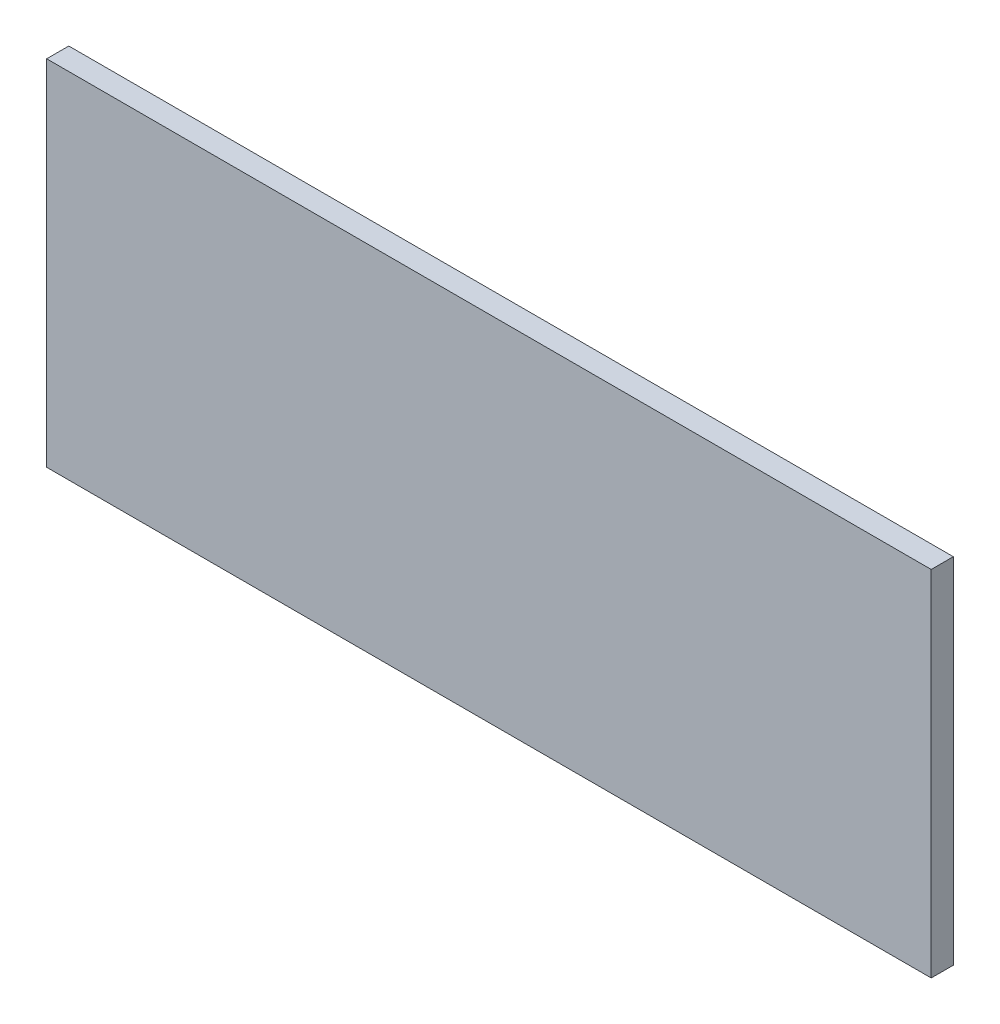
ISO-10303-21;
HEADER;
FILE_DESCRIPTION(('STEP AP214'),'2;1');
FILE_NAME('part.step','',(''),(''),'','','');
FILE_SCHEMA(('AUTOMOTIVE_DESIGN { 1 0 10303 214 1 1 1 1 }'));
ENDSEC;
DATA;
#1=APPLICATION_CONTEXT('core data for automotive mechanical design processes');
#2=APPLICATION_PROTOCOL_DEFINITION('international standard','automotive_design',2000,#1);
#3=PRODUCT_CONTEXT('',#1,'mechanical');
#4=PRODUCT('Part','Part','',(#3));
#5=PRODUCT_RELATED_PRODUCT_CATEGORY('part','',(#4));
#6=PRODUCT_DEFINITION_FORMATION('','',#4);
#7=PRODUCT_DEFINITION_CONTEXT('part definition',#1,'design');
#8=PRODUCT_DEFINITION('design','',#6,#7);
#9=PRODUCT_DEFINITION_SHAPE('','',#8);
#10=(LENGTH_UNIT() NAMED_UNIT(*) SI_UNIT(.MILLI.,.METRE.));
#11=(NAMED_UNIT(*) PLANE_ANGLE_UNIT() SI_UNIT($,.RADIAN.));
#12=(NAMED_UNIT(*) SI_UNIT($,.STERADIAN.) SOLID_ANGLE_UNIT());
#13=UNCERTAINTY_MEASURE_WITH_UNIT(LENGTH_MEASURE(1.E-05),#10,'distance_accuracy_value','');
#14=(GEOMETRIC_REPRESENTATION_CONTEXT(3) GLOBAL_UNCERTAINTY_ASSIGNED_CONTEXT((#13)) GLOBAL_UNIT_ASSIGNED_CONTEXT((#10,
#11,#12)) REPRESENTATION_CONTEXT('',''));
#15=CARTESIAN_POINT('',(0.,0.,0.));
#16=DIRECTION('',(0.,0.,1.));
#17=DIRECTION('',(1.,0.,0.));
#18=AXIS2_PLACEMENT_3D('',#15,#16,#17);
#19=CARTESIAN_POINT('',(100.,40.,2.5));
#20=DIRECTION('',(-1.,0.,0.));
#21=DIRECTION('',(0.,-1.,0.));
#22=AXIS2_PLACEMENT_3D('',#19,#20,#21);
#23=PLANE('',#22);
#24=DIRECTION('',(0.,1.,0.));
#25=VECTOR('',#24,1.);
#26=CARTESIAN_POINT('',(100.,40.,-2.5));
#27=LINE('',#26,#25);
#28=CARTESIAN_POINT('',(100.,-40.,-2.5));
#29=VERTEX_POINT('',#28);
#30=CARTESIAN_POINT('',(100.,40.,-2.5));
#31=VERTEX_POINT('',#30);
#32=EDGE_CURVE('E107',#29,#31,#27,.T.);
#33=ORIENTED_EDGE('',*,*,#32,.T.);
#34=DIRECTION('',(0.,0.,-1.));
#35=VECTOR('',#34,1.);
#36=CARTESIAN_POINT('',(100.,40.,2.5));
#37=LINE('',#36,#35);
#38=CARTESIAN_POINT('',(100.,40.,2.5));
#39=VERTEX_POINT('',#38);
#40=EDGE_CURVE('E11',#39,#31,#37,.T.);
#41=ORIENTED_EDGE('',*,*,#40,.F.);
#42=DIRECTION('',(0.,1.,0.));
#43=VECTOR('',#42,1.);
#44=CARTESIAN_POINT('',(100.,40.,2.5));
#45=LINE('',#44,#43);
#46=CARTESIAN_POINT('',(100.,-40.,2.5));
#47=VERTEX_POINT('',#46);
#48=EDGE_CURVE('E91',#47,#39,#45,.T.);
#49=ORIENTED_EDGE('',*,*,#48,.F.);
#50=DIRECTION('',(0.,0.,-1.));
#51=VECTOR('',#50,1.);
#52=CARTESIAN_POINT('',(100.,-40.,2.5));
#53=LINE('',#52,#51);
#54=EDGE_CURVE('E103',#47,#29,#53,.T.);
#55=ORIENTED_EDGE('',*,*,#54,.T.);
#56=EDGE_LOOP('',(#33,#41,#49,#55));
#57=FACE_BOUND('',#56,.T.);
#58=ADVANCED_FACE('F39',(#57),#23,.F.);
#59=CARTESIAN_POINT('',(-100.,40.,2.5));
#60=DIRECTION('',(0.,-1.,0.));
#61=DIRECTION('',(0.,0.,-1.));
#62=AXIS2_PLACEMENT_3D('',#59,#60,#61);
#63=PLANE('',#62);
#64=DIRECTION('',(-1.,0.,0.));
#65=VECTOR('',#64,1.);
#66=CARTESIAN_POINT('',(-100.,40.,-2.5));
#67=LINE('',#66,#65);
#68=CARTESIAN_POINT('',(-100.,40.,-2.5));
#69=VERTEX_POINT('',#68);
#70=EDGE_CURVE('E96',#31,#69,#67,.T.);
#71=ORIENTED_EDGE('',*,*,#70,.T.);
#72=DIRECTION('',(0.,0.,-1.));
#73=VECTOR('',#72,1.);
#74=CARTESIAN_POINT('',(-100.,40.,2.5));
#75=LINE('',#74,#73);
#76=CARTESIAN_POINT('',(-100.,40.,2.5));
#77=VERTEX_POINT('',#76);
#78=EDGE_CURVE('E48',#77,#69,#75,.T.);
#79=ORIENTED_EDGE('',*,*,#78,.F.);
#80=DIRECTION('',(-1.,0.,0.));
#81=VECTOR('',#80,1.);
#82=CARTESIAN_POINT('',(-100.,40.,2.5));
#83=LINE('',#82,#81);
#84=EDGE_CURVE('E86',#39,#77,#83,.T.);
#85=ORIENTED_EDGE('',*,*,#84,.F.);
#86=ORIENTED_EDGE('',*,*,#40,.T.);
#87=EDGE_LOOP('',(#71,#79,#85,#86));
#88=FACE_BOUND('',#87,.T.);
#89=ADVANCED_FACE('F95',(#88),#63,.F.);
#90=CARTESIAN_POINT('',(-100.,40.,2.5));
#91=DIRECTION('',(1.,0.,0.));
#92=DIRECTION('',(0.,1.,0.));
#93=AXIS2_PLACEMENT_3D('',#90,#91,#92);
#94=PLANE('',#93);
#95=DIRECTION('',(0.,-1.,0.));
#96=VECTOR('',#95,1.);
#97=CARTESIAN_POINT('',(-100.,40.,-2.5));
#98=LINE('',#97,#96);
#99=CARTESIAN_POINT('',(-100.,-40.,-2.5));
#100=VERTEX_POINT('',#99);
#101=EDGE_CURVE('E73',#69,#100,#98,.T.);
#102=ORIENTED_EDGE('',*,*,#101,.T.);
#103=DIRECTION('',(0.,0.,-1.));
#104=VECTOR('',#103,1.);
#105=CARTESIAN_POINT('',(-100.,-40.,2.5));
#106=LINE('',#105,#104);
#107=CARTESIAN_POINT('',(-100.,-40.,2.5));
#108=VERTEX_POINT('',#107);
#109=EDGE_CURVE('E98',#108,#100,#106,.T.);
#110=ORIENTED_EDGE('',*,*,#109,.F.);
#111=DIRECTION('',(0.,-1.,0.));
#112=VECTOR('',#111,1.);
#113=CARTESIAN_POINT('',(-100.,40.,2.5));
#114=LINE('',#113,#112);
#115=EDGE_CURVE('E89',#77,#108,#114,.T.);
#116=ORIENTED_EDGE('',*,*,#115,.F.);
#117=ORIENTED_EDGE('',*,*,#78,.T.);
#118=EDGE_LOOP('',(#102,#110,#116,#117));
#119=FACE_BOUND('',#118,.T.);
#120=ADVANCED_FACE('F99',(#119),#94,.F.);
#121=CARTESIAN_POINT('',(-100.,-40.,2.5));
#122=DIRECTION('',(0.,1.,0.));
#123=DIRECTION('',(0.,0.,1.));
#124=AXIS2_PLACEMENT_3D('',#121,#122,#123);
#125=PLANE('',#124);
#126=DIRECTION('',(1.,0.,0.));
#127=VECTOR('',#126,1.);
#128=CARTESIAN_POINT('',(-100.,-40.,-2.5));
#129=LINE('',#128,#127);
#130=EDGE_CURVE('E79',#100,#29,#129,.T.);
#131=ORIENTED_EDGE('',*,*,#130,.T.);
#132=ORIENTED_EDGE('',*,*,#54,.F.);
#133=DIRECTION('',(1.,0.,0.));
#134=VECTOR('',#133,1.);
#135=CARTESIAN_POINT('',(-100.,-40.,2.5));
#136=LINE('',#135,#134);
#137=EDGE_CURVE('E56',#108,#47,#136,.T.);
#138=ORIENTED_EDGE('',*,*,#137,.F.);
#139=ORIENTED_EDGE('',*,*,#109,.T.);
#140=EDGE_LOOP('',(#131,#132,#138,#139));
#141=FACE_BOUND('',#140,.T.);
#142=ADVANCED_FACE('F120',(#141),#125,.F.);
#143=CARTESIAN_POINT('',(0.,0.,2.5));
#144=DIRECTION('',(0.,0.,1.));
#145=DIRECTION('',(1.,0.,0.));
#146=AXIS2_PLACEMENT_3D('',#143,#144,#145);
#147=PLANE('',#146);
#148=ORIENTED_EDGE('',*,*,#48,.T.);
#149=ORIENTED_EDGE('',*,*,#84,.T.);
#150=ORIENTED_EDGE('',*,*,#115,.T.);
#151=ORIENTED_EDGE('',*,*,#137,.T.);
#152=EDGE_LOOP('',(#148,#149,#150,#151));
#153=FACE_BOUND('',#152,.T.);
#154=ADVANCED_FACE('F87',(#153),#147,.T.);
#155=CARTESIAN_POINT('',(0.,0.,-2.5));
#156=DIRECTION('',(0.,0.,1.));
#157=DIRECTION('',(1.,0.,0.));
#158=AXIS2_PLACEMENT_3D('',#155,#156,#157);
#159=PLANE('',#158);
#160=ORIENTED_EDGE('',*,*,#32,.F.);
#161=ORIENTED_EDGE('',*,*,#130,.F.);
#162=ORIENTED_EDGE('',*,*,#101,.F.);
#163=ORIENTED_EDGE('',*,*,#70,.F.);
#164=EDGE_LOOP('',(#160,#161,#162,#163));
#165=FACE_BOUND('',#164,.T.);
#166=ADVANCED_FACE('F123',(#165),#159,.F.);
#167=CLOSED_SHELL('',(#58,#89,#120,#142,#154,#166));
#168=MANIFOLD_SOLID_BREP('B2',#167);
#169=ADVANCED_BREP_SHAPE_REPRESENTATION('',(#18,#168),#14);
#170=SHAPE_DEFINITION_REPRESENTATION(#9,#169);
ENDSEC;
END-ISO-10303-21;
